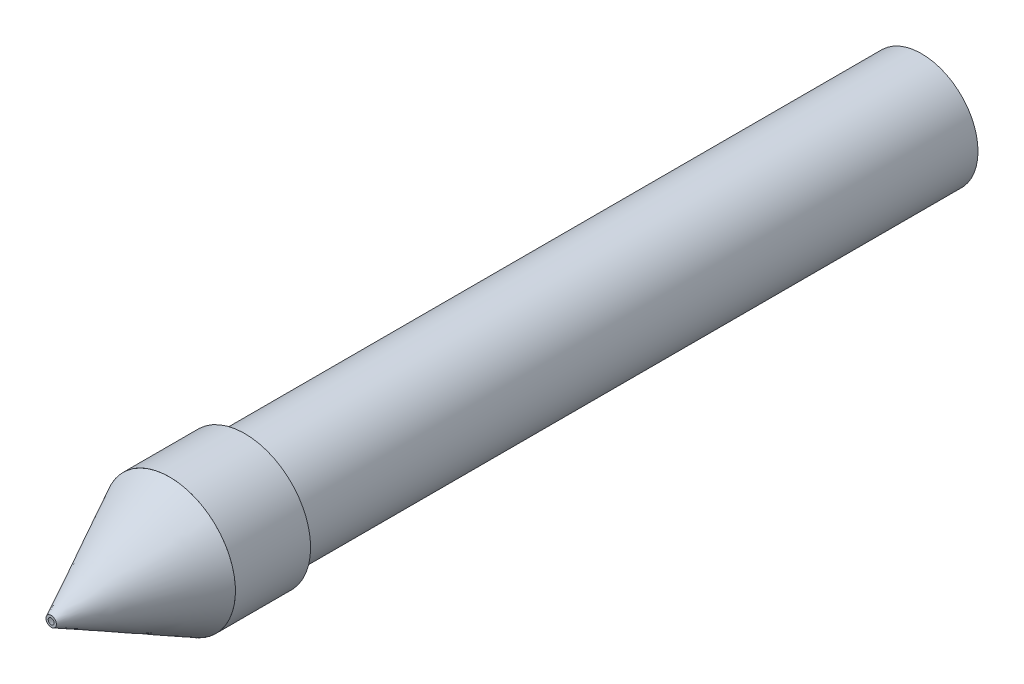
ISO-10303-21;
HEADER;
FILE_DESCRIPTION(('STEP AP214'),'2;1');
FILE_NAME('part.step','',(''),(''),'','','');
FILE_SCHEMA(('AUTOMOTIVE_DESIGN { 1 0 10303 214 1 1 1 1 }'));
ENDSEC;
DATA;
#1=APPLICATION_CONTEXT('core data for automotive mechanical design processes');
#2=APPLICATION_PROTOCOL_DEFINITION('international standard','automotive_design',2000,#1);
#3=PRODUCT_CONTEXT('',#1,'mechanical');
#4=PRODUCT('Part','Part','',(#3));
#5=PRODUCT_RELATED_PRODUCT_CATEGORY('part','',(#4));
#6=PRODUCT_DEFINITION_FORMATION('','',#4);
#7=PRODUCT_DEFINITION_CONTEXT('part definition',#1,'design');
#8=PRODUCT_DEFINITION('design','',#6,#7);
#9=PRODUCT_DEFINITION_SHAPE('','',#8);
#10=(LENGTH_UNIT() NAMED_UNIT(*) SI_UNIT(.MILLI.,.METRE.));
#11=(NAMED_UNIT(*) PLANE_ANGLE_UNIT() SI_UNIT($,.RADIAN.));
#12=(NAMED_UNIT(*) SI_UNIT($,.STERADIAN.) SOLID_ANGLE_UNIT());
#13=UNCERTAINTY_MEASURE_WITH_UNIT(LENGTH_MEASURE(1.E-05),#10,'distance_accuracy_value','');
#14=(GEOMETRIC_REPRESENTATION_CONTEXT(3) GLOBAL_UNCERTAINTY_ASSIGNED_CONTEXT((#13)) GLOBAL_UNIT_ASSIGNED_CONTEXT((#10,
#11,#12)) REPRESENTATION_CONTEXT('',''));
#15=CARTESIAN_POINT('',(0.,0.,0.));
#16=DIRECTION('',(0.,0.,1.));
#17=DIRECTION('',(1.,0.,0.));
#18=AXIS2_PLACEMENT_3D('',#15,#16,#17);
#19=CARTESIAN_POINT('',(0.,0.,254.));
#20=DIRECTION('',(0.,0.,1.));
#21=DIRECTION('',(1.,0.,0.));
#22=AXIS2_PLACEMENT_3D('',#19,#20,#21);
#23=PLANE('',#22);
#24=CARTESIAN_POINT('',(0.,0.,254.));
#25=DIRECTION('',(0.,0.,1.));
#26=DIRECTION('',(1.,0.,0.));
#27=AXIS2_PLACEMENT_3D('',#24,#25,#26);
#28=CIRCLE('',#27,15.875);
#29=CARTESIAN_POINT('',(13.2684418617213,8.71573723572034,254.));
#30=VERTEX_POINT('',#29);
#31=EDGE_CURVE('E141',#30,#30,#28,.T.);
#32=ORIENTED_EDGE('',*,*,#31,.T.);
#33=EDGE_LOOP('',(#32));
#34=FACE_BOUND('',#33,.T.);
#35=CARTESIAN_POINT('',(0.,0.,254.));
#36=DIRECTION('',(0.,0.,1.));
#37=DIRECTION('',(1.,0.,0.));
#38=AXIS2_PLACEMENT_3D('',#35,#36,#37);
#39=CIRCLE('',#38,22.225);
#40=CARTESIAN_POINT('',(-22.0733986582495,2.59146612441439,254.));
#41=VERTEX_POINT('',#40);
#42=EDGE_CURVE('E12',#41,#41,#39,.T.);
#43=ORIENTED_EDGE('',*,*,#42,.F.);
#44=EDGE_LOOP('',(#43));
#45=FACE_BOUND('',#44,.T.);
#46=ADVANCED_FACE('F60',(#34,#45),#23,.F.);
#47=CARTESIAN_POINT('',(0.,0.,294.));
#48=DIRECTION('',(0.,0.,1.));
#49=DIRECTION('',(1.,0.,0.));
#50=AXIS2_PLACEMENT_3D('',#47,#48,#49);
#51=PLANE('',#50);
#52=CARTESIAN_POINT('',(0.,0.,294.));
#53=DIRECTION('',(0.,0.,1.));
#54=DIRECTION('',(1.,0.,0.));
#55=AXIS2_PLACEMENT_3D('',#52,#53,#54);
#56=CIRCLE('',#55,1.);
#57=CARTESIAN_POINT('',(0.985750481765498,-0.168214112663262,294.));
#58=VERTEX_POINT('',#57);
#59=EDGE_CURVE('E75',#58,#58,#56,.T.);
#60=ORIENTED_EDGE('',*,*,#59,.F.);
#61=EDGE_LOOP('',(#60));
#62=FACE_BOUND('',#61,.T.);
#63=CARTESIAN_POINT('',(0.,0.,294.));
#64=DIRECTION('',(0.,0.,1.));
#65=DIRECTION('',(1.,0.,0.));
#66=AXIS2_PLACEMENT_3D('',#63,#64,#65);
#67=CIRCLE('',#66,1.75);
#68=CARTESIAN_POINT('',(-1.60737780168176,0.691980203951471,294.));
#69=VERTEX_POINT('',#68);
#70=EDGE_CURVE('E69',#69,#69,#67,.T.);
#71=ORIENTED_EDGE('',*,*,#70,.T.);
#72=EDGE_LOOP('',(#71));
#73=FACE_BOUND('',#72,.T.);
#74=ADVANCED_FACE('F95',(#62,#73),#51,.T.);
#75=CARTESIAN_POINT('',(-1.60737780168176,0.691980203951471,294.));
#76=CARTESIAN_POINT('',(-22.0733986582495,2.59146612441439,254.));
#77=CARTESIAN_POINT('',(-0.223417393778817,3.90673580731499,294.));
#78=CARTESIAN_POINT('',(-16.8904664094208,46.7382634409135,254.));
#79=CARTESIAN_POINT('',(2.9913382095847,2.52277539941204,294.));
#80=CARTESIAN_POINT('',(27.2563309070783,41.5553311920847,254.));
#81=CARTESIAN_POINT('',(1.60737780168176,-0.691980203951471,294.));
#82=CARTESIAN_POINT('',(22.0733986582495,-2.5914661244144,254.));
#83=CARTESIAN_POINT('',(0.223417393778817,-3.90673580731499,294.));
#84=CARTESIAN_POINT('',(16.8904664094207,-46.7382634409135,254.));
#85=CARTESIAN_POINT('',(-2.9913382095847,-2.52277539941205,294.));
#86=CARTESIAN_POINT('',(-27.2563309070784,-41.5553311920847,254.));
#87=CARTESIAN_POINT('',(-1.60737780168176,0.691980203951471,294.));
#88=CARTESIAN_POINT('',(-22.0733986582495,2.59146612441439,254.));
#89=(BOUNDED_SURFACE() B_SPLINE_SURFACE(3,1,((#75,#76),(#77,#78),(#79,#80),(#81,#82),(#83,#84),
(#85,#86),(#87,#88)),.UNSPECIFIED.,.T.,.F.,.F.) B_SPLINE_SURFACE_WITH_KNOTS((4,3,4),(2,2),(0.,
0.5,1.),(0.,1.),.UNSPECIFIED.) GEOMETRIC_REPRESENTATION_ITEM() RATIONAL_B_SPLINE_SURFACE(((1.,
1.),(0.333333333333333,0.333333333333333),(0.333333333333333,0.333333333333333),(1.,1.),
(0.333333333333333,0.333333333333333),(0.333333333333333,0.333333333333333),(1.,1.))) REPRESENTATION_ITEM('') SURFACE());
#90=CARTESIAN_POINT('',(-1.60737780168176,0.691980203951471,294.));
#91=CARTESIAN_POINT('',(-1.82056551893767,0.711766515622959,293.583333333333));
#92=CARTESIAN_POINT('',(-2.03375323619358,0.731552827294448,293.166666666667));
#93=CARTESIAN_POINT('',(-2.46012867070541,0.771125450637425,292.333333333333));
#94=CARTESIAN_POINT('',(-2.67331638796133,0.790911762308914,291.916666666667));
#95=CARTESIAN_POINT('',(-3.09969182247316,0.830484385651892,291.083333333333));
#96=CARTESIAN_POINT('',(-3.31287953972908,0.850270697323381,290.666666666667));
#97=CARTESIAN_POINT('',(-3.73925497424091,0.889843320666359,289.833333333333));
#98=CARTESIAN_POINT('',(-3.95244269149681,0.909629632337847,289.416666666667));
#99=CARTESIAN_POINT('',(-4.37881812600864,0.949202255680825,288.583333333333));
#100=CARTESIAN_POINT('',(-4.59200584326456,0.968988567352314,288.166666666667));
#101=CARTESIAN_POINT('',(-5.01838127777639,1.00856119069529,287.333333333333));
#102=CARTESIAN_POINT('',(-5.2315689950323,1.02834750236678,286.916666666667));
#103=CARTESIAN_POINT('',(-5.65794442954413,1.06792012570976,286.083333333333));
#104=CARTESIAN_POINT('',(-5.87113214680005,1.08770643738125,285.666666666667));
#105=CARTESIAN_POINT('',(-6.29750758131188,1.12727906072422,284.833333333333));
#106=CARTESIAN_POINT('',(-6.51069529856779,1.14706537239571,284.416666666667));
#107=CARTESIAN_POINT('',(-6.93707073307962,1.18663799573869,283.583333333333));
#108=CARTESIAN_POINT('',(-7.15025845033554,1.20642430741018,283.166666666667));
#109=CARTESIAN_POINT('',(-7.57663388484737,1.24599693075316,282.333333333333));
#110=CARTESIAN_POINT('',(-7.78982160210328,1.26578324242465,281.916666666667));
#111=CARTESIAN_POINT('',(-8.2161970366151,1.30535586576762,281.083333333333));
#112=CARTESIAN_POINT('',(-8.42938475387102,1.32514217743911,280.666666666667));
#113=CARTESIAN_POINT('',(-8.85576018838285,1.36471480078209,279.833333333333));
#114=CARTESIAN_POINT('',(-9.06894790563877,1.38450111245358,279.416666666667));
#115=CARTESIAN_POINT('',(-9.4953233401506,1.42407373579656,278.583333333333));
#116=CARTESIAN_POINT('',(-9.70851105740651,1.44386004746804,278.166666666667));
#117=CARTESIAN_POINT('',(-10.1348864919183,1.48343267081102,277.333333333333));
#118=CARTESIAN_POINT('',(-10.3480742091742,1.50321898248251,276.916666666667));
#119=CARTESIAN_POINT('',(-10.7744496436861,1.54279160582549,276.083333333333));
#120=CARTESIAN_POINT('',(-10.987637360942,1.56257791749698,275.666666666667));
#121=CARTESIAN_POINT('',(-11.4140127954538,1.60215054083996,274.833333333333));
#122=CARTESIAN_POINT('',(-11.6272005127097,1.62193685251144,274.416666666667));
#123=CARTESIAN_POINT('',(-12.0535759472216,1.66150947585442,273.583333333333));
#124=CARTESIAN_POINT('',(-12.2667636644775,1.68129578752591,273.166666666667));
#125=CARTESIAN_POINT('',(-12.6931390989893,1.72086841086889,272.333333333333));
#126=CARTESIAN_POINT('',(-12.9063268162452,1.74065472254038,271.916666666667));
#127=CARTESIAN_POINT('',(-13.332702250757,1.78022734588335,271.083333333333));
#128=CARTESIAN_POINT('',(-13.545889968013,1.80001365755484,270.666666666667));
#129=CARTESIAN_POINT('',(-13.9722654025248,1.83958628089782,269.833333333333));
#130=CARTESIAN_POINT('',(-14.1854531197807,1.85937259256931,269.416666666667));
#131=CARTESIAN_POINT('',(-14.6118285542925,1.89894521591229,268.583333333333));
#132=CARTESIAN_POINT('',(-14.8250162715485,1.91873152758378,268.166666666667));
#133=CARTESIAN_POINT('',(-15.2513917060603,1.95830415092675,267.333333333333));
#134=CARTESIAN_POINT('',(-15.4645794233162,1.97809046259824,266.916666666667));
#135=CARTESIAN_POINT('',(-15.890954857828,2.01766308594122,266.083333333333));
#136=CARTESIAN_POINT('',(-16.1041425750839,2.03744939761271,265.666666666667));
#137=CARTESIAN_POINT('',(-16.5305180095958,2.07702202095569,264.833333333333));
#138=CARTESIAN_POINT('',(-16.7437057268517,2.09680833262717,264.416666666667));
#139=CARTESIAN_POINT('',(-17.1700811613635,2.13638095597015,263.583333333333));
#140=CARTESIAN_POINT('',(-17.3832688786194,2.15616726764164,263.166666666667));
#141=CARTESIAN_POINT('',(-17.8096443131313,2.19573989098462,262.333333333333));
#142=CARTESIAN_POINT('',(-18.0228320303872,2.21552620265611,261.916666666667));
#143=CARTESIAN_POINT('',(-18.449207464899,2.25509882599909,261.083333333333));
#144=CARTESIAN_POINT('',(-18.6623951821549,2.27488513767057,260.666666666667));
#145=CARTESIAN_POINT('',(-19.0887706166667,2.31445776101355,259.833333333333));
#146=CARTESIAN_POINT('',(-19.3019583339227,2.33424407268504,259.416666666667));
#147=CARTESIAN_POINT('',(-19.7283337684345,2.37381669602802,258.583333333333));
#148=CARTESIAN_POINT('',(-19.9415214856904,2.39360300769951,258.166666666667));
#149=CARTESIAN_POINT('',(-20.3678969202022,2.43317563104248,257.333333333333));
#150=CARTESIAN_POINT('',(-20.5810846374581,2.45296194271397,256.916666666667));
#151=CARTESIAN_POINT('',(-21.00746007197,2.49253456605695,256.083333333333));
#152=CARTESIAN_POINT('',(-21.2206477892259,2.51232087772844,255.666666666667));
#153=CARTESIAN_POINT('',(-21.6470232237377,2.55189350107142,254.833333333333));
#154=CARTESIAN_POINT('',(-21.8602109409936,2.57167981274291,254.416666666667));
#155=CARTESIAN_POINT('',(-22.0733986582495,2.59146612441439,254.));
#156=B_SPLINE_CURVE_WITH_KNOTS('',3,(#90,#91,#92,#93,#94,#95,#96,#97,#98,#99,#100,#101,#102,
#103,#104,#105,#106,#107,#108,#109,#110,#111,#112,#113,#114,#115,#116,#117,#118,#119,#120,#121,
#122,#123,#124,#125,#126,#127,#128,#129,#130,#131,#132,#133,#134,#135,#136,#137,#138,#139,#140,
#141,#142,#143,#144,#145,#146,#147,#148,#149,#150,#151,#152,#153,#154,#155),.UNSPECIFIED.,.F.,
.F.,(4,2,2,2,2,2,2,2,2,2,2,2,2,2,2,2,2,2,2,2,2,2,2,2,2,2,2,2,2,2,2,2,4),(0.,1.4053698830789,
2.81073976615776,4.21610964923661,5.62147953231552,7.02684941539437,8.43221929847328,
9.83758918155213,11.242959064631,12.6483289477099,14.0536988307888,15.4590687138676,
16.8644385969465,18.2698084800254,19.6751783631043,21.0805482461832,22.485918129262,
23.8912880123409,25.2966578954198,26.7020277784987,28.1073976615775,29.5127675446565,
30.9181374277353,32.3235073108142,33.7288771938931,35.134247076972,36.5396169600508,
37.9449868431297,39.3503567262086,40.7557266092875,42.1610964923664,43.5664663754452,
44.9718362585241),.UNSPECIFIED.);
#157=EDGE_CURVE('BSEAM104',#69,#41,#156,.T.);
#158=ORIENTED_EDGE('',*,*,#70,.F.);
#159=ORIENTED_EDGE('',*,*,#42,.T.);
#160=ORIENTED_EDGE('',*,*,#157,.T.);
#161=ORIENTED_EDGE('',*,*,#157,.F.);
#162=EDGE_LOOP('',(#158,#160,#159,#161));
#163=FACE_BOUND('',#162,.T.);
#164=ADVANCED_FACE('F104',(#163),#89,.T.);
#165=CARTESIAN_POINT('',(13.2684418617213,8.71573723572034,254.));
#166=CARTESIAN_POINT('',(0.985750481765498,-0.168214112663262,294.));
#167=CARTESIAN_POINT('',(-4.16303260971939,35.2526209591629,254.));
#168=CARTESIAN_POINT('',(1.32217870709202,1.80328685086773,294.));
#169=CARTESIAN_POINT('',(-30.699916333162,17.8211464877222,254.));
#170=CARTESIAN_POINT('',(-0.649322256438974,2.13971507619426,294.));
#171=CARTESIAN_POINT('',(-13.2684418617213,-8.71573723572034,254.));
#172=CARTESIAN_POINT('',(-0.985750481765498,0.168214112663262,294.));
#173=CARTESIAN_POINT('',(4.16303260971939,-35.2526209591629,254.));
#174=CARTESIAN_POINT('',(-1.32217870709202,-1.80328685086773,294.));
#175=CARTESIAN_POINT('',(30.699916333162,-17.8211464877222,254.));
#176=CARTESIAN_POINT('',(0.649322256438974,-2.13971507619426,294.));
#177=CARTESIAN_POINT('',(13.2684418617213,8.71573723572034,254.));
#178=CARTESIAN_POINT('',(0.985750481765498,-0.168214112663262,294.));
#179=(BOUNDED_SURFACE() B_SPLINE_SURFACE(3,1,((#165,#166),(#167,#168),(#169,#170),(#171,#172),
(#173,#174),(#175,#176),(#177,#178)),.UNSPECIFIED.,.T.,.F.,.F.) B_SPLINE_SURFACE_WITH_KNOTS((4,
3,4),(2,2),(0.,0.5,1.),(0.,1.),
.UNSPECIFIED.) GEOMETRIC_REPRESENTATION_ITEM() RATIONAL_B_SPLINE_SURFACE(((1.,1.),
(0.333333333333333,0.333333333333333),(0.333333333333333,0.333333333333333),(1.,1.),
(0.333333333333333,0.333333333333333),(0.333333333333333,0.333333333333333),(1.,1.))) REPRESENTATION_ITEM('') SURFACE());
#180=CARTESIAN_POINT('',(13.2684418617213,8.71573723572034,254.));
#181=CARTESIAN_POINT('',(13.1404971598468,8.62319607584135,254.416666666667));
#182=CARTESIAN_POINT('',(13.0125524579722,8.53065491596235,254.833333333333));
#183=CARTESIAN_POINT('',(12.7566630542231,8.34557259620436,255.666666666667));
#184=CARTESIAN_POINT('',(12.6287183523486,8.25303143632536,256.083333333333));
#185=CARTESIAN_POINT('',(12.3728289485995,8.06794911656737,256.916666666667));
#186=CARTESIAN_POINT('',(12.244884246725,7.97540795668837,257.333333333333));
#187=CARTESIAN_POINT('',(11.9889948429759,7.79032563693038,258.166666666667));
#188=CARTESIAN_POINT('',(11.8610501411014,7.69778447705139,258.583333333333));
#189=CARTESIAN_POINT('',(11.6051607373523,7.5127021572934,259.416666666667));
#190=CARTESIAN_POINT('',(11.4772160354777,7.4201609974144,259.833333333333));
#191=CARTESIAN_POINT('',(11.2213266317287,7.23507867765641,260.666666666667));
#192=CARTESIAN_POINT('',(11.0933819298541,7.14253751777741,261.083333333333));
#193=CARTESIAN_POINT('',(10.837492526105,6.95745519801942,261.916666666667));
#194=CARTESIAN_POINT('',(10.7095478242305,6.86491403814042,262.333333333333));
#195=CARTESIAN_POINT('',(10.4536584204814,6.67983171838243,263.166666666667));
#196=CARTESIAN_POINT('',(10.3257137186069,6.58729055850344,263.583333333333));
#197=CARTESIAN_POINT('',(10.0698243148578,6.40220823874545,264.416666666667));
#198=CARTESIAN_POINT('',(9.94187961298326,6.30966707886645,264.833333333333));
#199=CARTESIAN_POINT('',(9.68599020923418,6.12458475910846,265.666666666667));
#200=CARTESIAN_POINT('',(9.55804550735965,6.03204359922946,266.083333333333));
#201=CARTESIAN_POINT('',(9.30215610361057,5.84696127947147,266.916666666667));
#202=CARTESIAN_POINT('',(9.17421140173602,5.75442011959247,267.333333333333));
#203=CARTESIAN_POINT('',(8.91832199798695,5.56933779983448,268.166666666667));
#204=CARTESIAN_POINT('',(8.79037729611241,5.47679663995549,268.583333333333));
#205=CARTESIAN_POINT('',(8.53448789236333,5.2917143201975,269.416666666667));
#206=CARTESIAN_POINT('',(8.40654319048879,5.1991731603185,269.833333333333));
#207=CARTESIAN_POINT('',(8.15065378673971,5.01409084056051,270.666666666667));
#208=CARTESIAN_POINT('',(8.02270908486517,4.92154968068151,271.083333333333));
#209=CARTESIAN_POINT('',(7.76681968111609,4.73646736092352,271.916666666667));
#210=CARTESIAN_POINT('',(7.63887497924155,4.64392620104452,272.333333333333));
#211=CARTESIAN_POINT('',(7.38298557549247,4.45884388128653,273.166666666667));
#212=CARTESIAN_POINT('',(7.25504087361794,4.36630272140754,273.583333333333));
#213=CARTESIAN_POINT('',(6.99915146986886,4.18122040164955,274.416666666667));
#214=CARTESIAN_POINT('',(6.87120676799432,4.08867924177055,274.833333333333));
#215=CARTESIAN_POINT('',(6.61531736424523,3.90359692201256,275.666666666667));
#216=CARTESIAN_POINT('',(6.48737266237069,3.81105576213356,276.083333333333));
#217=CARTESIAN_POINT('',(6.23148325862161,3.62597344237557,276.916666666667));
#218=CARTESIAN_POINT('',(6.10353855674708,3.53343228249657,277.333333333333));
#219=CARTESIAN_POINT('',(5.847649152998,3.34834996273858,278.166666666667));
#220=CARTESIAN_POINT('',(5.71970445112346,3.25580880285959,278.583333333333));
#221=CARTESIAN_POINT('',(5.46381504737438,3.0707264831016,279.416666666667));
#222=CARTESIAN_POINT('',(5.33587034549984,2.9781853232226,279.833333333333));
#223=CARTESIAN_POINT('',(5.07998094175076,2.7931030034646,280.666666666667));
#224=CARTESIAN_POINT('',(4.95203623987622,2.70056184358561,281.083333333333));
#225=CARTESIAN_POINT('',(4.69614683612714,2.51547952382762,281.916666666667));
#226=CARTESIAN_POINT('',(4.56820213425261,2.42293836394862,282.333333333333));
#227=CARTESIAN_POINT('',(4.31231273050353,2.23785604419063,283.166666666667));
#228=CARTESIAN_POINT('',(4.18436802862898,2.14531488431163,283.583333333333));
#229=CARTESIAN_POINT('',(3.9284786248799,1.96023256455364,284.416666666667));
#230=CARTESIAN_POINT('',(3.80053392300537,1.86769140467465,284.833333333333));
#231=CARTESIAN_POINT('',(3.54464451925629,1.68260908491666,285.666666666667));
#232=CARTESIAN_POINT('',(3.41669981738175,1.59006792503766,286.083333333333));
#233=CARTESIAN_POINT('',(3.16081041363267,1.40498560527967,286.916666666667));
#234=CARTESIAN_POINT('',(3.03286571175813,1.31244444540067,287.333333333333));
#235=CARTESIAN_POINT('',(2.77697630800905,1.12736212564268,288.166666666667));
#236=CARTESIAN_POINT('',(2.64903160613451,1.03482096576368,288.583333333333));
#237=CARTESIAN_POINT('',(2.39314220238543,0.84973864600569,289.416666666667));
#238=CARTESIAN_POINT('',(2.26519750051089,0.757197486126698,289.833333333333));
#239=CARTESIAN_POINT('',(2.00930809676182,0.572115166368707,290.666666666667));
#240=CARTESIAN_POINT('',(1.88136339488728,0.47957400648971,291.083333333333));
#241=CARTESIAN_POINT('',(1.62547399113819,0.294491686731716,291.916666666667));
#242=CARTESIAN_POINT('',(1.49752928926365,0.20195052685272,292.333333333333));
#243=CARTESIAN_POINT('',(1.24163988551457,0.0168682070947273,293.166666666667));
#244=CARTESIAN_POINT('',(1.11369518364003,-0.075672952784269,293.583333333333));
#245=CARTESIAN_POINT('',(0.985750481765498,-0.168214112663262,294.));
#246=B_SPLINE_CURVE_WITH_KNOTS('',3,(#180,#181,#182,#183,#184,#185,#186,#187,#188,#189,#190,
#191,#192,#193,#194,#195,#196,#197,#198,#199,#200,#201,#202,#203,#204,#205,#206,#207,#208,#209,
#210,#211,#212,#213,#214,#215,#216,#217,#218,#219,#220,#221,#222,#223,#224,#225,#226,#227,#228,
#229,#230,#231,#232,#233,#234,#235,#236,#237,#238,#239,#240,#241,#242,#243,#244,#245),
.UNSPECIFIED.,.F.,.F.,(4,2,2,2,2,2,2,2,2,2,2,2,2,2,2,2,2,2,2,2,2,2,2,2,2,2,2,2,2,2,2,2,4),(0.,
1.33675106773314,2.67350213546624,4.01025320319933,5.34700427093248,6.68375533866562,
8.02050640639872,9.35725747413181,10.694008541865,12.0307596095981,13.3675106773312,
14.7042617450643,16.0410128127974,17.3777638805305,18.7145149482636,20.0512660159968,
21.3880170837299,22.724768151463,24.0615192191961,25.3982702869292,26.7350213546624,
28.0717724223955,29.4085234901286,30.7452745578617,32.0820256255948,33.418776693328,
34.7555277610611,36.0922788287942,37.4290298965273,38.7657809642604,40.1025320319935,
41.4392830997266,42.7760341674598),.UNSPECIFIED.);
#247=EDGE_CURVE('BSEAM106',#30,#58,#246,.T.);
#248=ORIENTED_EDGE('',*,*,#31,.F.);
#249=ORIENTED_EDGE('',*,*,#59,.T.);
#250=ORIENTED_EDGE('',*,*,#247,.T.);
#251=ORIENTED_EDGE('',*,*,#247,.F.);
#252=EDGE_LOOP('',(#248,#250,#249,#251));
#253=FACE_BOUND('',#252,.T.);
#254=ADVANCED_FACE('F106',(#253),#179,.F.);
#255=CLOSED_SHELL('',(#46,#74,#164,#254));
#256=MANIFOLD_SOLID_BREP('B2',#255);
#257=CARTESIAN_POINT('',(0.,0.,228.6));
#258=DIRECTION('',(0.,0.,1.));
#259=DIRECTION('',(1.,0.,0.));
#260=AXIS2_PLACEMENT_3D('',#257,#258,#259);
#261=CYLINDRICAL_SURFACE('',#260,22.225);
#262=CARTESIAN_POINT('',(0.,0.,228.6));
#263=DIRECTION('',(0.,0.,1.));
#264=DIRECTION('',(1.,0.,0.));
#265=AXIS2_PLACEMENT_3D('',#262,#263,#264);
#266=CIRCLE('',#265,22.225);
#267=CARTESIAN_POINT('',(22.225,0.,228.6));
#268=VERTEX_POINT('',#267);
#269=EDGE_CURVE('E59',#268,#268,#266,.T.);
#270=ORIENTED_EDGE('',*,*,#269,.T.);
#271=EDGE_LOOP('',(#270));
#272=FACE_BOUND('',#271,.T.);
#273=CARTESIAN_POINT('',(0.,0.,254.));
#274=DIRECTION('',(0.,0.,1.));
#275=DIRECTION('',(1.,0.,0.));
#276=AXIS2_PLACEMENT_3D('',#273,#274,#275);
#277=CIRCLE('',#276,22.225);
#278=CARTESIAN_POINT('',(22.225,0.,254.));
#279=VERTEX_POINT('',#278);
#280=EDGE_CURVE('E194',#279,#279,#277,.T.);
#281=ORIENTED_EDGE('',*,*,#280,.F.);
#282=EDGE_LOOP('',(#281));
#283=FACE_BOUND('',#282,.T.);
#284=ADVANCED_FACE('F191',(#272,#283),#261,.T.);
#285=CARTESIAN_POINT('',(0.,0.,228.6));
#286=DIRECTION('',(0.,0.,1.));
#287=DIRECTION('',(1.,0.,0.));
#288=AXIS2_PLACEMENT_3D('',#285,#286,#287);
#289=PLANE('',#288);
#290=CARTESIAN_POINT('',(0.,0.,228.6));
#291=DIRECTION('',(0.,0.,1.));
#292=DIRECTION('',(1.,0.,0.));
#293=AXIS2_PLACEMENT_3D('',#290,#291,#292);
#294=CIRCLE('',#293,19.05);
#295=CARTESIAN_POINT('',(19.05,0.,228.6));
#296=VERTEX_POINT('',#295);
#297=EDGE_CURVE('E201',#296,#296,#294,.T.);
#298=ORIENTED_EDGE('',*,*,#297,.T.);
#299=EDGE_LOOP('',(#298));
#300=FACE_BOUND('',#299,.T.);
#301=ORIENTED_EDGE('',*,*,#269,.F.);
#302=EDGE_LOOP('',(#301));
#303=FACE_BOUND('',#302,.T.);
#304=ADVANCED_FACE('F209',(#300,#303),#289,.F.);
#305=CARTESIAN_POINT('',(0.,0.,254.));
#306=DIRECTION('',(0.,0.,1.));
#307=DIRECTION('',(1.,0.,0.));
#308=AXIS2_PLACEMENT_3D('',#305,#306,#307);
#309=PLANE('',#308);
#310=CARTESIAN_POINT('',(0.,0.,254.));
#311=DIRECTION('',(0.,0.,1.));
#312=DIRECTION('',(1.,0.,0.));
#313=AXIS2_PLACEMENT_3D('',#310,#311,#312);
#314=CIRCLE('',#313,19.05);
#315=CARTESIAN_POINT('',(19.05,0.,254.));
#316=VERTEX_POINT('',#315);
#317=EDGE_CURVE('E203',#316,#316,#314,.T.);
#318=ORIENTED_EDGE('',*,*,#317,.F.);
#319=EDGE_LOOP('',(#318));
#320=FACE_BOUND('',#319,.T.);
#321=ORIENTED_EDGE('',*,*,#280,.T.);
#322=EDGE_LOOP('',(#321));
#323=FACE_BOUND('',#322,.T.);
#324=ADVANCED_FACE('F215',(#320,#323),#309,.T.);
#325=CARTESIAN_POINT('',(0.,0.,228.6));
#326=DIRECTION('',(0.,0.,1.));
#327=DIRECTION('',(1.,0.,0.));
#328=AXIS2_PLACEMENT_3D('',#325,#326,#327);
#329=CYLINDRICAL_SURFACE('',#328,19.05);
#330=ORIENTED_EDGE('',*,*,#297,.F.);
#331=EDGE_LOOP('',(#330));
#332=FACE_BOUND('',#331,.T.);
#333=ORIENTED_EDGE('',*,*,#317,.T.);
#334=EDGE_LOOP('',(#333));
#335=FACE_BOUND('',#334,.T.);
#336=ADVANCED_FACE('F212',(#332,#335),#329,.F.);
#337=CLOSED_SHELL('',(#284,#304,#324,#336));
#338=MANIFOLD_SOLID_BREP('B7',#337);
#339=CARTESIAN_POINT('',(0.,0.,254.));
#340=DIRECTION('',(0.,0.,1.));
#341=DIRECTION('',(1.,0.,0.));
#342=AXIS2_PLACEMENT_3D('',#339,#340,#341);
#343=PLANE('',#342);
#344=CARTESIAN_POINT('',(0.,0.,254.));
#345=DIRECTION('',(0.,0.,1.));
#346=DIRECTION('',(1.,0.,0.));
#347=AXIS2_PLACEMENT_3D('',#344,#345,#346);
#348=CIRCLE('',#347,19.05);
#349=CARTESIAN_POINT('',(19.05,0.,254.));
#350=VERTEX_POINT('',#349);
#351=EDGE_CURVE('E190',#350,#350,#348,.T.);
#352=ORIENTED_EDGE('',*,*,#351,.T.);
#353=EDGE_LOOP('',(#352));
#354=FACE_BOUND('',#353,.T.);
#355=CARTESIAN_POINT('',(0.,0.,254.));
#356=DIRECTION('',(0.,0.,1.));
#357=DIRECTION('',(1.,0.,0.));
#358=AXIS2_PLACEMENT_3D('',#355,#356,#357);
#359=CIRCLE('',#358,15.875);
#360=CARTESIAN_POINT('',(15.875,0.,254.));
#361=VERTEX_POINT('',#360);
#362=EDGE_CURVE('E264',#361,#361,#359,.T.);
#363=ORIENTED_EDGE('',*,*,#362,.F.);
#364=EDGE_LOOP('',(#363));
#365=FACE_BOUND('',#364,.T.);
#366=ADVANCED_FACE('F253',(#354,#365),#343,.T.);
#367=CARTESIAN_POINT('',(0.,0.,0.));
#368=DIRECTION('',(0.,0.,1.));
#369=DIRECTION('',(1.,0.,0.));
#370=AXIS2_PLACEMENT_3D('',#367,#368,#369);
#371=PLANE('',#370);
#372=CARTESIAN_POINT('',(0.,0.,0.));
#373=DIRECTION('',(0.,0.,1.));
#374=DIRECTION('',(1.,0.,0.));
#375=AXIS2_PLACEMENT_3D('',#372,#373,#374);
#376=CIRCLE('',#375,19.05);
#377=CARTESIAN_POINT('',(19.05,0.,0.));
#378=VERTEX_POINT('',#377);
#379=EDGE_CURVE('E257',#378,#378,#376,.T.);
#380=ORIENTED_EDGE('',*,*,#379,.F.);
#381=EDGE_LOOP('',(#380));
#382=FACE_BOUND('',#381,.T.);
#383=CARTESIAN_POINT('',(0.,0.,0.));
#384=DIRECTION('',(0.,0.,1.));
#385=DIRECTION('',(1.,0.,0.));
#386=AXIS2_PLACEMENT_3D('',#383,#384,#385);
#387=CIRCLE('',#386,15.875);
#388=CARTESIAN_POINT('',(15.875,0.,0.));
#389=VERTEX_POINT('',#388);
#390=EDGE_CURVE('E266',#389,#389,#387,.T.);
#391=ORIENTED_EDGE('',*,*,#390,.T.);
#392=EDGE_LOOP('',(#391));
#393=FACE_BOUND('',#392,.T.);
#394=ADVANCED_FACE('F276',(#382,#393),#371,.F.);
#395=CARTESIAN_POINT('',(0.,0.,254.));
#396=DIRECTION('',(0.,0.,-1.));
#397=DIRECTION('',(-1.,0.,0.));
#398=AXIS2_PLACEMENT_3D('',#395,#396,#397);
#399=CYLINDRICAL_SURFACE('',#398,19.05);
#400=ORIENTED_EDGE('',*,*,#351,.F.);
#401=EDGE_LOOP('',(#400));
#402=FACE_BOUND('',#401,.T.);
#403=ORIENTED_EDGE('',*,*,#379,.T.);
#404=EDGE_LOOP('',(#403));
#405=FACE_BOUND('',#404,.T.);
#406=ADVANCED_FACE('F255',(#402,#405),#399,.T.);
#407=CARTESIAN_POINT('',(0.,0.,254.));
#408=DIRECTION('',(0.,0.,-1.));
#409=DIRECTION('',(-1.,0.,0.));
#410=AXIS2_PLACEMENT_3D('',#407,#408,#409);
#411=CYLINDRICAL_SURFACE('',#410,15.875);
#412=ORIENTED_EDGE('',*,*,#362,.T.);
#413=EDGE_LOOP('',(#412));
#414=FACE_BOUND('',#413,.T.);
#415=ORIENTED_EDGE('',*,*,#390,.F.);
#416=EDGE_LOOP('',(#415));
#417=FACE_BOUND('',#416,.T.);
#418=ADVANCED_FACE('F272',(#414,#417),#411,.F.);
#419=CLOSED_SHELL('',(#366,#394,#406,#418));
#420=MANIFOLD_SOLID_BREP('B54_NOT_SHOWN',#419);
#421=ADVANCED_BREP_SHAPE_REPRESENTATION('',(#18,#256,#338,#420),#14);
#422=SHAPE_DEFINITION_REPRESENTATION(#9,#421);
ENDSEC;
END-ISO-10303-21;
